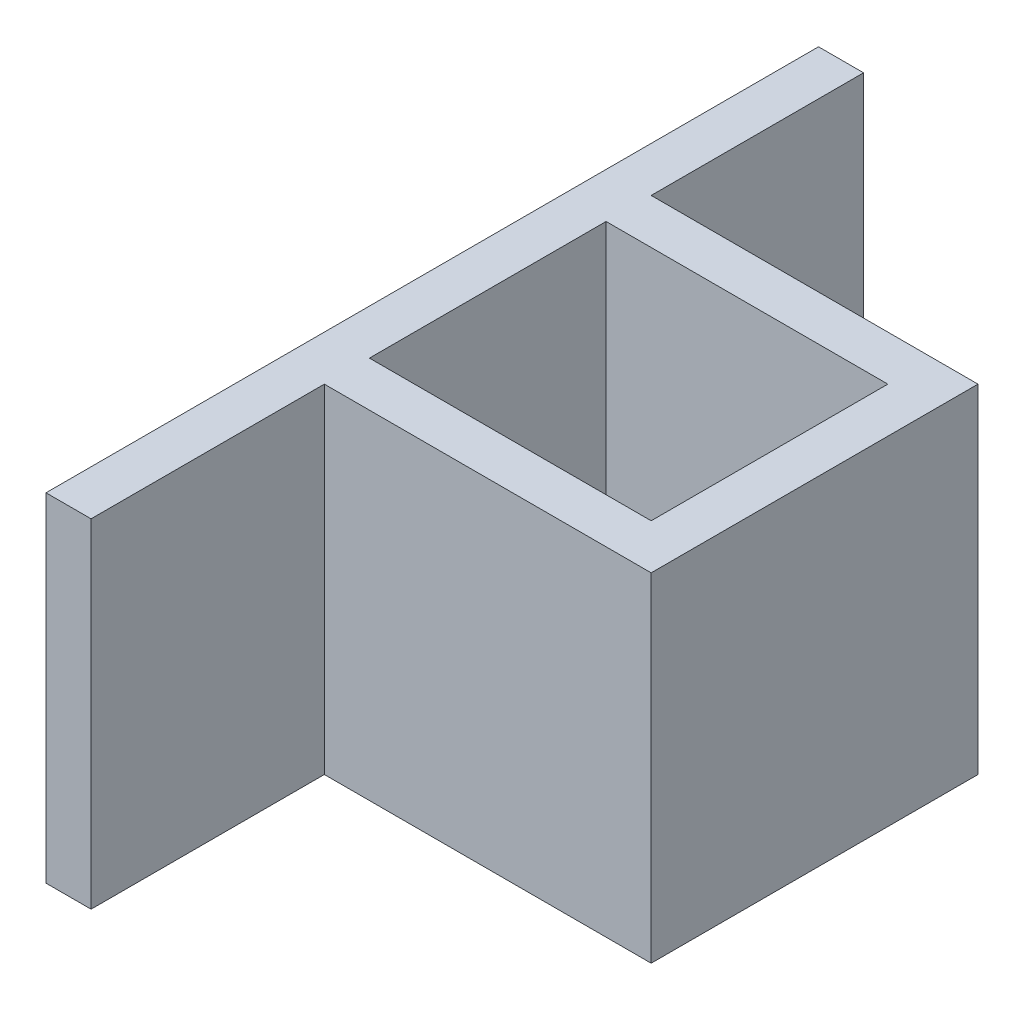
ISO-10303-21;
HEADER;
FILE_DESCRIPTION(('STEP AP214'),'2;1');
FILE_NAME('part.step','',(''),(''),'','','');
FILE_SCHEMA(('AUTOMOTIVE_DESIGN { 1 0 10303 214 1 1 1 1 }'));
ENDSEC;
DATA;
#1=APPLICATION_CONTEXT('core data for automotive mechanical design processes');
#2=APPLICATION_PROTOCOL_DEFINITION('international standard','automotive_design',2000,#1);
#3=PRODUCT_CONTEXT('',#1,'mechanical');
#4=PRODUCT('Part','Part','',(#3));
#5=PRODUCT_RELATED_PRODUCT_CATEGORY('part','',(#4));
#6=PRODUCT_DEFINITION_FORMATION('','',#4);
#7=PRODUCT_DEFINITION_CONTEXT('part definition',#1,'design');
#8=PRODUCT_DEFINITION('design','',#6,#7);
#9=PRODUCT_DEFINITION_SHAPE('','',#8);
#10=(LENGTH_UNIT() NAMED_UNIT(*) SI_UNIT(.MILLI.,.METRE.));
#11=(NAMED_UNIT(*) PLANE_ANGLE_UNIT() SI_UNIT($,.RADIAN.));
#12=(NAMED_UNIT(*) SI_UNIT($,.STERADIAN.) SOLID_ANGLE_UNIT());
#13=UNCERTAINTY_MEASURE_WITH_UNIT(LENGTH_MEASURE(1.E-05),#10,'distance_accuracy_value','');
#14=(GEOMETRIC_REPRESENTATION_CONTEXT(3) GLOBAL_UNCERTAINTY_ASSIGNED_CONTEXT((#13)) GLOBAL_UNIT_ASSIGNED_CONTEXT((#10,
#11,#12)) REPRESENTATION_CONTEXT('',''));
#15=CARTESIAN_POINT('',(0.,0.,0.));
#16=DIRECTION('',(0.,0.,1.));
#17=DIRECTION('',(1.,0.,0.));
#18=AXIS2_PLACEMENT_3D('',#15,#16,#17);
#19=CARTESIAN_POINT('',(0.,15.,0.));
#20=DIRECTION('',(0.,-1.,0.));
#21=DIRECTION('',(0.,0.,-1.));
#22=AXIS2_PLACEMENT_3D('',#19,#20,#21);
#23=PLANE('',#22);
#24=DIRECTION('',(0.,0.,1.));
#25=VECTOR('',#24,1.);
#26=CARTESIAN_POINT('',(-2.,15.,-2.));
#27=LINE('',#26,#25);
#28=CARTESIAN_POINT('',(-2.,15.,-11.4239673961762));
#29=VERTEX_POINT('',#28);
#30=CARTESIAN_POINT('',(-2.,15.,22.8490153813468));
#31=VERTEX_POINT('',#30);
#32=EDGE_CURVE('E158',#29,#31,#27,.T.);
#33=ORIENTED_EDGE('',*,*,#32,.T.);
#34=DIRECTION('',(1.,0.,0.));
#35=VECTOR('',#34,1.);
#36=CARTESIAN_POINT('',(-2.,15.,22.8490153813468));
#37=LINE('',#36,#35);
#38=CARTESIAN_POINT('',(0.,15.,22.8490153813468));
#39=VERTEX_POINT('',#38);
#40=EDGE_CURVE('E160',#31,#39,#37,.T.);
#41=ORIENTED_EDGE('',*,*,#40,.T.);
#42=DIRECTION('',(0.,0.,-1.));
#43=VECTOR('',#42,1.);
#44=CARTESIAN_POINT('',(0.,15.,22.8490153813468));
#45=LINE('',#44,#43);
#46=CARTESIAN_POINT('',(0.,15.,12.5));
#47=VERTEX_POINT('',#46);
#48=EDGE_CURVE('E163',#39,#47,#45,.T.);
#49=ORIENTED_EDGE('',*,*,#48,.T.);
#50=DIRECTION('',(1.,0.,0.));
#51=VECTOR('',#50,1.);
#52=CARTESIAN_POINT('',(0.,15.,12.5));
#53=LINE('',#52,#51);
#54=CARTESIAN_POINT('',(14.5,15.,12.5));
#55=VERTEX_POINT('',#54);
#56=EDGE_CURVE('E165',#47,#55,#53,.T.);
#57=ORIENTED_EDGE('',*,*,#56,.T.);
#58=DIRECTION('',(0.,0.,-1.));
#59=VECTOR('',#58,1.);
#60=CARTESIAN_POINT('',(14.5,15.,-2.));
#61=LINE('',#60,#59);
#62=CARTESIAN_POINT('',(14.5,15.,-2.));
#63=VERTEX_POINT('',#62);
#64=EDGE_CURVE('E167',#55,#63,#61,.T.);
#65=ORIENTED_EDGE('',*,*,#64,.T.);
#66=DIRECTION('',(-1.,0.,0.));
#67=VECTOR('',#66,1.);
#68=CARTESIAN_POINT('',(0.,15.,-2.));
#69=LINE('',#68,#67);
#70=CARTESIAN_POINT('',(0.,15.,-2.));
#71=VERTEX_POINT('',#70);
#72=EDGE_CURVE('E169',#63,#71,#69,.T.);
#73=ORIENTED_EDGE('',*,*,#72,.T.);
#74=DIRECTION('',(0.,0.,-1.));
#75=VECTOR('',#74,1.);
#76=CARTESIAN_POINT('',(0.,15.,-11.4239673961762));
#77=LINE('',#76,#75);
#78=CARTESIAN_POINT('',(0.,15.,-11.4239673961762));
#79=VERTEX_POINT('',#78);
#80=EDGE_CURVE('E171',#71,#79,#77,.T.);
#81=ORIENTED_EDGE('',*,*,#80,.T.);
#82=DIRECTION('',(-1.,0.,0.));
#83=VECTOR('',#82,1.);
#84=CARTESIAN_POINT('',(-2.,15.,-11.4239673961762));
#85=LINE('',#84,#83);
#86=EDGE_CURVE('E173',#79,#29,#85,.T.);
#87=ORIENTED_EDGE('',*,*,#86,.T.);
#88=EDGE_LOOP('',(#33,#41,#49,#57,#65,#73,#81,#87));
#89=FACE_BOUND('',#88,.T.);
#90=DIRECTION('',(0.,0.,1.));
#91=VECTOR('',#90,1.);
#92=CARTESIAN_POINT('',(0.,15.,0.));
#93=LINE('',#92,#91);
#94=CARTESIAN_POINT('',(0.,15.,0.));
#95=VERTEX_POINT('',#94);
#96=CARTESIAN_POINT('',(0.,15.,10.5));
#97=VERTEX_POINT('',#96);
#98=EDGE_CURVE('E122',#95,#97,#93,.T.);
#99=ORIENTED_EDGE('',*,*,#98,.F.);
#100=DIRECTION('',(-1.,0.,0.));
#101=VECTOR('',#100,1.);
#102=CARTESIAN_POINT('',(0.,15.,0.));
#103=LINE('',#102,#101);
#104=CARTESIAN_POINT('',(12.5,15.,0.));
#105=VERTEX_POINT('',#104);
#106=EDGE_CURVE('E144',#105,#95,#103,.T.);
#107=ORIENTED_EDGE('',*,*,#106,.F.);
#108=DIRECTION('',(0.,0.,-1.));
#109=VECTOR('',#108,1.);
#110=CARTESIAN_POINT('',(12.5,15.,0.));
#111=LINE('',#110,#109);
#112=CARTESIAN_POINT('',(12.5,15.,10.5));
#113=VERTEX_POINT('',#112);
#114=EDGE_CURVE('E142',#113,#105,#111,.T.);
#115=ORIENTED_EDGE('',*,*,#114,.F.);
#116=DIRECTION('',(1.,0.,0.));
#117=VECTOR('',#116,1.);
#118=CARTESIAN_POINT('',(0.,15.,10.5));
#119=LINE('',#118,#117);
#120=EDGE_CURVE('E130',#97,#113,#119,.T.);
#121=ORIENTED_EDGE('',*,*,#120,.F.);
#122=EDGE_LOOP('',(#99,#107,#115,#121));
#123=FACE_BOUND('',#122,.T.);
#124=ADVANCED_FACE('F33',(#89,#123),#23,.F.);
#125=CARTESIAN_POINT('',(0.,0.,0.));
#126=DIRECTION('',(0.,-1.,0.));
#127=DIRECTION('',(0.,0.,-1.));
#128=AXIS2_PLACEMENT_3D('',#125,#126,#127);
#129=PLANE('',#128);
#130=DIRECTION('',(0.,0.,1.));
#131=VECTOR('',#130,1.);
#132=CARTESIAN_POINT('',(-2.,0.,12.5));
#133=LINE('',#132,#131);
#134=CARTESIAN_POINT('',(-2.,0.,-11.4239673961762));
#135=VERTEX_POINT('',#134);
#136=CARTESIAN_POINT('',(-2.,0.,22.8490153813468));
#137=VERTEX_POINT('',#136);
#138=EDGE_CURVE('E138',#135,#137,#133,.T.);
#139=ORIENTED_EDGE('',*,*,#138,.F.);
#140=DIRECTION('',(-1.,0.,0.));
#141=VECTOR('',#140,1.);
#142=CARTESIAN_POINT('',(-2.,0.,-11.4239673961762));
#143=LINE('',#142,#141);
#144=CARTESIAN_POINT('',(0.,0.,-11.4239673961762));
#145=VERTEX_POINT('',#144);
#146=EDGE_CURVE('E161',#145,#135,#143,.T.);
#147=ORIENTED_EDGE('',*,*,#146,.F.);
#148=DIRECTION('',(0.,0.,-1.));
#149=VECTOR('',#148,1.);
#150=CARTESIAN_POINT('',(0.,0.,-11.4239673961762));
#151=LINE('',#150,#149);
#152=CARTESIAN_POINT('',(0.,0.,-2.));
#153=VERTEX_POINT('',#152);
#154=EDGE_CURVE('E187',#153,#145,#151,.T.);
#155=ORIENTED_EDGE('',*,*,#154,.F.);
#156=DIRECTION('',(-1.,0.,0.));
#157=VECTOR('',#156,1.);
#158=CARTESIAN_POINT('',(0.,0.,-2.));
#159=LINE('',#158,#157);
#160=CARTESIAN_POINT('',(14.5,0.,-2.));
#161=VERTEX_POINT('',#160);
#162=EDGE_CURVE('E185',#161,#153,#159,.T.);
#163=ORIENTED_EDGE('',*,*,#162,.F.);
#164=DIRECTION('',(0.,0.,-1.));
#165=VECTOR('',#164,1.);
#166=CARTESIAN_POINT('',(14.5,0.,-2.));
#167=LINE('',#166,#165);
#168=CARTESIAN_POINT('',(14.5,0.,12.5));
#169=VERTEX_POINT('',#168);
#170=EDGE_CURVE('E183',#169,#161,#167,.T.);
#171=ORIENTED_EDGE('',*,*,#170,.F.);
#172=DIRECTION('',(1.,0.,0.));
#173=VECTOR('',#172,1.);
#174=CARTESIAN_POINT('',(0.,0.,12.5));
#175=LINE('',#174,#173);
#176=CARTESIAN_POINT('',(0.,0.,12.5));
#177=VERTEX_POINT('',#176);
#178=EDGE_CURVE('E181',#177,#169,#175,.T.);
#179=ORIENTED_EDGE('',*,*,#178,.F.);
#180=DIRECTION('',(0.,0.,-1.));
#181=VECTOR('',#180,1.);
#182=CARTESIAN_POINT('',(0.,0.,22.8490153813468));
#183=LINE('',#182,#181);
#184=CARTESIAN_POINT('',(0.,0.,22.8490153813468));
#185=VERTEX_POINT('',#184);
#186=EDGE_CURVE('E179',#185,#177,#183,.T.);
#187=ORIENTED_EDGE('',*,*,#186,.F.);
#188=DIRECTION('',(1.,0.,0.));
#189=VECTOR('',#188,1.);
#190=CARTESIAN_POINT('',(-2.,0.,22.8490153813468));
#191=LINE('',#190,#189);
#192=EDGE_CURVE('E177',#137,#185,#191,.T.);
#193=ORIENTED_EDGE('',*,*,#192,.F.);
#194=EDGE_LOOP('',(#139,#147,#155,#163,#171,#179,#187,#193));
#195=FACE_BOUND('',#194,.T.);
#196=DIRECTION('',(-1.,0.,0.));
#197=VECTOR('',#196,1.);
#198=CARTESIAN_POINT('',(0.,0.,0.));
#199=LINE('',#198,#197);
#200=CARTESIAN_POINT('',(12.5,0.,0.));
#201=VERTEX_POINT('',#200);
#202=CARTESIAN_POINT('',(0.,0.,0.));
#203=VERTEX_POINT('',#202);
#204=EDGE_CURVE('E131',#201,#203,#199,.T.);
#205=ORIENTED_EDGE('',*,*,#204,.T.);
#206=DIRECTION('',(0.,0.,1.));
#207=VECTOR('',#206,1.);
#208=CARTESIAN_POINT('',(0.,0.,0.));
#209=LINE('',#208,#207);
#210=CARTESIAN_POINT('',(0.,0.,10.5));
#211=VERTEX_POINT('',#210);
#212=EDGE_CURVE('E56',#203,#211,#209,.T.);
#213=ORIENTED_EDGE('',*,*,#212,.T.);
#214=DIRECTION('',(1.,0.,0.));
#215=VECTOR('',#214,1.);
#216=CARTESIAN_POINT('',(0.,0.,10.5));
#217=LINE('',#216,#215);
#218=CARTESIAN_POINT('',(12.5,0.,10.5));
#219=VERTEX_POINT('',#218);
#220=EDGE_CURVE('E137',#211,#219,#217,.T.);
#221=ORIENTED_EDGE('',*,*,#220,.T.);
#222=DIRECTION('',(0.,0.,-1.));
#223=VECTOR('',#222,1.);
#224=CARTESIAN_POINT('',(12.5,0.,0.));
#225=LINE('',#224,#223);
#226=EDGE_CURVE('E150',#219,#201,#225,.T.);
#227=ORIENTED_EDGE('',*,*,#226,.T.);
#228=EDGE_LOOP('',(#205,#213,#221,#227));
#229=FACE_BOUND('',#228,.T.);
#230=ADVANCED_FACE('F219',(#195,#229),#129,.T.);
#231=CARTESIAN_POINT('',(-2.,15.,12.5));
#232=DIRECTION('',(1.,0.,0.));
#233=DIRECTION('',(0.,0.,-1.));
#234=AXIS2_PLACEMENT_3D('',#231,#232,#233);
#235=PLANE('',#234);
#236=ORIENTED_EDGE('',*,*,#138,.T.);
#237=DIRECTION('',(0.,-1.,0.));
#238=VECTOR('',#237,1.);
#239=CARTESIAN_POINT('',(-2.,15.,22.8490153813468));
#240=LINE('',#239,#238);
#241=EDGE_CURVE('E11',#31,#137,#240,.T.);
#242=ORIENTED_EDGE('',*,*,#241,.F.);
#243=ORIENTED_EDGE('',*,*,#32,.F.);
#244=DIRECTION('',(0.,-1.,0.));
#245=VECTOR('',#244,1.);
#246=CARTESIAN_POINT('',(-2.,15.,-11.4239673961762));
#247=LINE('',#246,#245);
#248=EDGE_CURVE('E175',#29,#135,#247,.T.);
#249=ORIENTED_EDGE('',*,*,#248,.T.);
#250=EDGE_LOOP('',(#236,#242,#243,#249));
#251=FACE_BOUND('',#250,.T.);
#252=ADVANCED_FACE('F35',(#251),#235,.F.);
#253=CARTESIAN_POINT('',(-2.,15.,22.8490153813468));
#254=DIRECTION('',(0.,0.,-1.));
#255=DIRECTION('',(-1.,0.,0.));
#256=AXIS2_PLACEMENT_3D('',#253,#254,#255);
#257=PLANE('',#256);
#258=ORIENTED_EDGE('',*,*,#192,.T.);
#259=DIRECTION('',(0.,-1.,0.));
#260=VECTOR('',#259,1.);
#261=CARTESIAN_POINT('',(0.,15.,22.8490153813468));
#262=LINE('',#261,#260);
#263=EDGE_CURVE('E41',#39,#185,#262,.T.);
#264=ORIENTED_EDGE('',*,*,#263,.F.);
#265=ORIENTED_EDGE('',*,*,#40,.F.);
#266=ORIENTED_EDGE('',*,*,#241,.T.);
#267=EDGE_LOOP('',(#258,#264,#265,#266));
#268=FACE_BOUND('',#267,.T.);
#269=ADVANCED_FACE('F236',(#268),#257,.F.);
#270=CARTESIAN_POINT('',(0.,15.,22.8490153813468));
#271=DIRECTION('',(-1.,0.,0.));
#272=DIRECTION('',(0.,0.,1.));
#273=AXIS2_PLACEMENT_3D('',#270,#271,#272);
#274=PLANE('',#273);
#275=ORIENTED_EDGE('',*,*,#186,.T.);
#276=DIRECTION('',(0.,-1.,0.));
#277=VECTOR('',#276,1.);
#278=CARTESIAN_POINT('',(0.,15.,12.5));
#279=LINE('',#278,#277);
#280=EDGE_CURVE('E205',#47,#177,#279,.T.);
#281=ORIENTED_EDGE('',*,*,#280,.F.);
#282=ORIENTED_EDGE('',*,*,#48,.F.);
#283=ORIENTED_EDGE('',*,*,#263,.T.);
#284=EDGE_LOOP('',(#275,#281,#282,#283));
#285=FACE_BOUND('',#284,.T.);
#286=ADVANCED_FACE('F212',(#285),#274,.F.);
#287=CARTESIAN_POINT('',(0.,15.,12.5));
#288=DIRECTION('',(0.,0.,-1.));
#289=DIRECTION('',(-1.,0.,0.));
#290=AXIS2_PLACEMENT_3D('',#287,#288,#289);
#291=PLANE('',#290);
#292=ORIENTED_EDGE('',*,*,#178,.T.);
#293=DIRECTION('',(0.,-1.,0.));
#294=VECTOR('',#293,1.);
#295=CARTESIAN_POINT('',(14.5,15.,12.5));
#296=LINE('',#295,#294);
#297=EDGE_CURVE('E202',#55,#169,#296,.T.);
#298=ORIENTED_EDGE('',*,*,#297,.F.);
#299=ORIENTED_EDGE('',*,*,#56,.F.);
#300=ORIENTED_EDGE('',*,*,#280,.T.);
#301=EDGE_LOOP('',(#292,#298,#299,#300));
#302=FACE_BOUND('',#301,.T.);
#303=ADVANCED_FACE('F225',(#302),#291,.F.);
#304=CARTESIAN_POINT('',(14.5,15.,-2.));
#305=DIRECTION('',(-1.,0.,0.));
#306=DIRECTION('',(0.,0.,1.));
#307=AXIS2_PLACEMENT_3D('',#304,#305,#306);
#308=PLANE('',#307);
#309=ORIENTED_EDGE('',*,*,#170,.T.);
#310=DIRECTION('',(0.,-1.,0.));
#311=VECTOR('',#310,1.);
#312=CARTESIAN_POINT('',(14.5,15.,-2.));
#313=LINE('',#312,#311);
#314=EDGE_CURVE('E199',#63,#161,#313,.T.);
#315=ORIENTED_EDGE('',*,*,#314,.F.);
#316=ORIENTED_EDGE('',*,*,#64,.F.);
#317=ORIENTED_EDGE('',*,*,#297,.T.);
#318=EDGE_LOOP('',(#309,#315,#316,#317));
#319=FACE_BOUND('',#318,.T.);
#320=ADVANCED_FACE('F229',(#319),#308,.F.);
#321=CARTESIAN_POINT('',(0.,15.,-2.));
#322=DIRECTION('',(0.,0.,1.));
#323=DIRECTION('',(1.,0.,0.));
#324=AXIS2_PLACEMENT_3D('',#321,#322,#323);
#325=PLANE('',#324);
#326=ORIENTED_EDGE('',*,*,#162,.T.);
#327=DIRECTION('',(0.,-1.,0.));
#328=VECTOR('',#327,1.);
#329=CARTESIAN_POINT('',(0.,15.,-2.));
#330=LINE('',#329,#328);
#331=EDGE_CURVE('E196',#71,#153,#330,.T.);
#332=ORIENTED_EDGE('',*,*,#331,.F.);
#333=ORIENTED_EDGE('',*,*,#72,.F.);
#334=ORIENTED_EDGE('',*,*,#314,.T.);
#335=EDGE_LOOP('',(#326,#332,#333,#334));
#336=FACE_BOUND('',#335,.T.);
#337=ADVANCED_FACE('F249',(#336),#325,.F.);
#338=CARTESIAN_POINT('',(0.,15.,-11.4239673961762));
#339=DIRECTION('',(-1.,0.,0.));
#340=DIRECTION('',(0.,0.,1.));
#341=AXIS2_PLACEMENT_3D('',#338,#339,#340);
#342=PLANE('',#341);
#343=ORIENTED_EDGE('',*,*,#154,.T.);
#344=DIRECTION('',(0.,-1.,0.));
#345=VECTOR('',#344,1.);
#346=CARTESIAN_POINT('',(0.,15.,-11.4239673961762));
#347=LINE('',#346,#345);
#348=EDGE_CURVE('E193',#79,#145,#347,.T.);
#349=ORIENTED_EDGE('',*,*,#348,.F.);
#350=ORIENTED_EDGE('',*,*,#80,.F.);
#351=ORIENTED_EDGE('',*,*,#331,.T.);
#352=EDGE_LOOP('',(#343,#349,#350,#351));
#353=FACE_BOUND('',#352,.T.);
#354=ADVANCED_FACE('F247',(#353),#342,.F.);
#355=CARTESIAN_POINT('',(-2.,15.,-11.4239673961762));
#356=DIRECTION('',(0.,0.,1.));
#357=DIRECTION('',(1.,0.,0.));
#358=AXIS2_PLACEMENT_3D('',#355,#356,#357);
#359=PLANE('',#358);
#360=ORIENTED_EDGE('',*,*,#146,.T.);
#361=ORIENTED_EDGE('',*,*,#248,.F.);
#362=ORIENTED_EDGE('',*,*,#86,.F.);
#363=ORIENTED_EDGE('',*,*,#348,.T.);
#364=EDGE_LOOP('',(#360,#361,#362,#363));
#365=FACE_BOUND('',#364,.T.);
#366=ADVANCED_FACE('F242',(#365),#359,.F.);
#367=CARTESIAN_POINT('',(0.,15.,0.));
#368=DIRECTION('',(1.,0.,0.));
#369=DIRECTION('',(0.,0.,-1.));
#370=AXIS2_PLACEMENT_3D('',#367,#368,#369);
#371=PLANE('',#370);
#372=ORIENTED_EDGE('',*,*,#212,.F.);
#373=DIRECTION('',(0.,-1.,0.));
#374=VECTOR('',#373,1.);
#375=CARTESIAN_POINT('',(0.,15.,0.));
#376=LINE('',#375,#374);
#377=EDGE_CURVE('E126',#95,#203,#376,.T.);
#378=ORIENTED_EDGE('',*,*,#377,.F.);
#379=ORIENTED_EDGE('',*,*,#98,.T.);
#380=DIRECTION('',(0.,-1.,0.));
#381=VECTOR('',#380,1.);
#382=CARTESIAN_POINT('',(0.,15.,10.5));
#383=LINE('',#382,#381);
#384=EDGE_CURVE('E125',#97,#211,#383,.T.);
#385=ORIENTED_EDGE('',*,*,#384,.T.);
#386=EDGE_LOOP('',(#372,#378,#379,#385));
#387=FACE_BOUND('',#386,.T.);
#388=ADVANCED_FACE('F124',(#387),#371,.T.);
#389=CARTESIAN_POINT('',(0.,15.,10.5));
#390=DIRECTION('',(0.,0.,-1.));
#391=DIRECTION('',(-1.,0.,0.));
#392=AXIS2_PLACEMENT_3D('',#389,#390,#391);
#393=PLANE('',#392);
#394=ORIENTED_EDGE('',*,*,#220,.F.);
#395=ORIENTED_EDGE('',*,*,#384,.F.);
#396=ORIENTED_EDGE('',*,*,#120,.T.);
#397=DIRECTION('',(0.,-1.,0.));
#398=VECTOR('',#397,1.);
#399=CARTESIAN_POINT('',(12.5,15.,10.5));
#400=LINE('',#399,#398);
#401=EDGE_CURVE('E139',#113,#219,#400,.T.);
#402=ORIENTED_EDGE('',*,*,#401,.T.);
#403=EDGE_LOOP('',(#394,#395,#396,#402));
#404=FACE_BOUND('',#403,.T.);
#405=ADVANCED_FACE('F134',(#404),#393,.T.);
#406=CARTESIAN_POINT('',(12.5,15.,0.));
#407=DIRECTION('',(-1.,0.,0.));
#408=DIRECTION('',(0.,0.,1.));
#409=AXIS2_PLACEMENT_3D('',#406,#407,#408);
#410=PLANE('',#409);
#411=ORIENTED_EDGE('',*,*,#226,.F.);
#412=ORIENTED_EDGE('',*,*,#401,.F.);
#413=ORIENTED_EDGE('',*,*,#114,.T.);
#414=DIRECTION('',(0.,-1.,0.));
#415=VECTOR('',#414,1.);
#416=CARTESIAN_POINT('',(12.5,15.,0.));
#417=LINE('',#416,#415);
#418=EDGE_CURVE('E48',#105,#201,#417,.T.);
#419=ORIENTED_EDGE('',*,*,#418,.T.);
#420=EDGE_LOOP('',(#411,#412,#413,#419));
#421=FACE_BOUND('',#420,.T.);
#422=ADVANCED_FACE('F274',(#421),#410,.T.);
#423=CARTESIAN_POINT('',(0.,15.,0.));
#424=DIRECTION('',(0.,0.,1.));
#425=DIRECTION('',(1.,0.,0.));
#426=AXIS2_PLACEMENT_3D('',#423,#424,#425);
#427=PLANE('',#426);
#428=ORIENTED_EDGE('',*,*,#204,.F.);
#429=ORIENTED_EDGE('',*,*,#418,.F.);
#430=ORIENTED_EDGE('',*,*,#106,.T.);
#431=ORIENTED_EDGE('',*,*,#377,.T.);
#432=EDGE_LOOP('',(#428,#429,#430,#431));
#433=FACE_BOUND('',#432,.T.);
#434=ADVANCED_FACE('F278',(#433),#427,.T.);
#435=CLOSED_SHELL('',(#124,#230,#252,#269,#286,#303,#320,#337,#354,#366,#388,#405,#422,#434));
#436=MANIFOLD_SOLID_BREP('B2',#435);
#437=ADVANCED_BREP_SHAPE_REPRESENTATION('',(#18,#436),#14);
#438=SHAPE_DEFINITION_REPRESENTATION(#9,#437);
ENDSEC;
END-ISO-10303-21;
